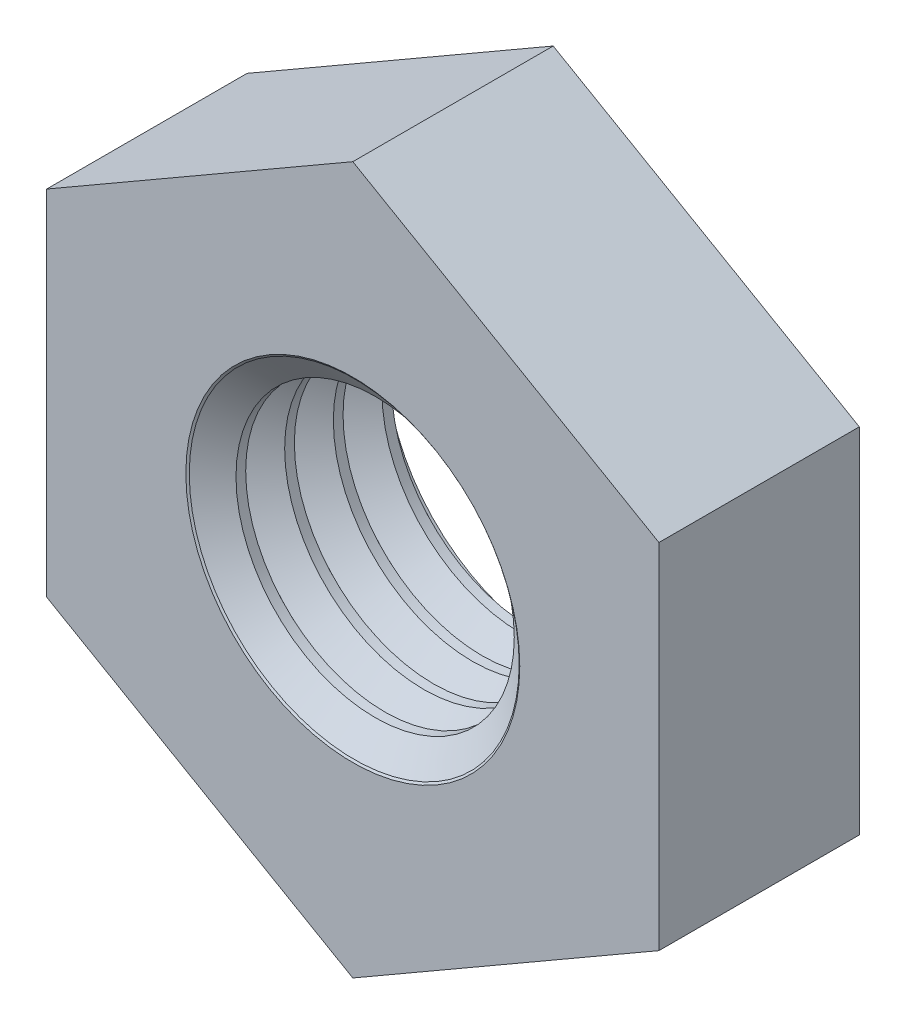
ISO-10303-21;
HEADER;
FILE_DESCRIPTION(('STEP AP214'),'2;1');
FILE_NAME('part.step','',(''),(''),'','','');
FILE_SCHEMA(('AUTOMOTIVE_DESIGN { 1 0 10303 214 1 1 1 1 }'));
ENDSEC;
DATA;
#1=APPLICATION_CONTEXT('core data for automotive mechanical design processes');
#2=APPLICATION_PROTOCOL_DEFINITION('international standard','automotive_design',2000,#1);
#3=PRODUCT_CONTEXT('',#1,'mechanical');
#4=PRODUCT('Part','Part','',(#3));
#5=PRODUCT_RELATED_PRODUCT_CATEGORY('part','',(#4));
#6=PRODUCT_DEFINITION_FORMATION('','',#4);
#7=PRODUCT_DEFINITION_CONTEXT('part definition',#1,'design');
#8=PRODUCT_DEFINITION('design','',#6,#7);
#9=PRODUCT_DEFINITION_SHAPE('','',#8);
#10=(LENGTH_UNIT() NAMED_UNIT(*) SI_UNIT(.MILLI.,.METRE.));
#11=(NAMED_UNIT(*) PLANE_ANGLE_UNIT() SI_UNIT($,.RADIAN.));
#12=(NAMED_UNIT(*) SI_UNIT($,.STERADIAN.) SOLID_ANGLE_UNIT());
#13=UNCERTAINTY_MEASURE_WITH_UNIT(LENGTH_MEASURE(1.E-05),#10,'distance_accuracy_value','');
#14=(GEOMETRIC_REPRESENTATION_CONTEXT(3) GLOBAL_UNCERTAINTY_ASSIGNED_CONTEXT((#13)) GLOBAL_UNIT_ASSIGNED_CONTEXT((#10,
#11,#12)) REPRESENTATION_CONTEXT('',''));
#15=CARTESIAN_POINT('',(0.,0.,0.));
#16=DIRECTION('',(0.,0.,1.));
#17=DIRECTION('',(1.,0.,0.));
#18=AXIS2_PLACEMENT_3D('',#15,#16,#17);
#19=CARTESIAN_POINT('',(0.,0.,-1.8));
#20=DIRECTION('',(0.,0.,1.));
#21=DIRECTION('',(1.,0.,0.));
#22=AXIS2_PLACEMENT_3D('',#19,#20,#21);
#23=CYLINDRICAL_SURFACE('',#22,1.25);
#24=CARTESIAN_POINT('',(0.,0.,-1.51235188455243));
#25=DIRECTION('',(0.,0.,-1.));
#26=DIRECTION('',(-1.,0.,0.));
#27=AXIS2_PLACEMENT_3D('',#24,#25,#26);
#28=CIRCLE('',#27,1.25);
#29=CARTESIAN_POINT('',(-1.25,0.,-1.51235188455243));
#30=VERTEX_POINT('',#29);
#31=EDGE_CURVE('E229',#30,#30,#28,.T.);
#32=ORIENTED_EDGE('',*,*,#31,.F.);
#33=EDGE_LOOP('',(#32));
#34=FACE_BOUND('',#33,.T.);
#35=CARTESIAN_POINT('',(0.,0.,-1.59954811544757));
#36=DIRECTION('',(0.,0.,-1.));
#37=DIRECTION('',(-1.,0.,0.));
#38=AXIS2_PLACEMENT_3D('',#35,#36,#37);
#39=CIRCLE('',#38,1.25);
#40=CARTESIAN_POINT('',(-1.25,0.,-1.59954811544757));
#41=VERTEX_POINT('',#40);
#42=EDGE_CURVE('E152',#41,#41,#39,.F.);
#43=ORIENTED_EDGE('',*,*,#42,.F.);
#44=EDGE_LOOP('',(#43));
#45=FACE_BOUND('',#44,.T.);
#46=ADVANCED_FACE('F41',(#34,#45),#23,.F.);
#47=CARTESIAN_POINT('',(0.,0.,-1.16224811544758));
#48=DIRECTION('',(0.,0.,-1.));
#49=DIRECTION('',(-1.,0.,0.));
#50=AXIS2_PLACEMENT_3D('',#47,#48,#49);
#51=CIRCLE('',#50,1.25);
#52=CARTESIAN_POINT('',(-1.25,0.,-1.16224811544758));
#53=VERTEX_POINT('',#52);
#54=EDGE_CURVE('E232',#53,#53,#51,.T.);
#55=ORIENTED_EDGE('',*,*,#54,.T.);
#56=EDGE_LOOP('',(#55));
#57=FACE_BOUND('',#56,.T.);
#58=CARTESIAN_POINT('',(0.,0.,-1.07505188455243));
#59=DIRECTION('',(0.,0.,-1.));
#60=DIRECTION('',(-1.,0.,0.));
#61=AXIS2_PLACEMENT_3D('',#58,#59,#60);
#62=CIRCLE('',#61,1.25);
#63=CARTESIAN_POINT('',(-1.25,0.,-1.07505188455243));
#64=VERTEX_POINT('',#63);
#65=EDGE_CURVE('E220',#64,#64,#62,.T.);
#66=ORIENTED_EDGE('',*,*,#65,.F.);
#67=EDGE_LOOP('',(#66));
#68=FACE_BOUND('',#67,.T.);
#69=ADVANCED_FACE('F179',(#57,#68),#23,.F.);
#70=CARTESIAN_POINT('',(0.,0.,-0.724948115447577));
#71=DIRECTION('',(0.,0.,-1.));
#72=DIRECTION('',(-1.,0.,0.));
#73=AXIS2_PLACEMENT_3D('',#70,#71,#72);
#74=CIRCLE('',#73,1.25);
#75=CARTESIAN_POINT('',(-1.25,0.,-0.724948115447577));
#76=VERTEX_POINT('',#75);
#77=EDGE_CURVE('E223',#76,#76,#74,.T.);
#78=ORIENTED_EDGE('',*,*,#77,.T.);
#79=EDGE_LOOP('',(#78));
#80=FACE_BOUND('',#79,.T.);
#81=CARTESIAN_POINT('',(0.,0.,-0.63775188455243));
#82=DIRECTION('',(0.,0.,-1.));
#83=DIRECTION('',(-1.,0.,0.));
#84=AXIS2_PLACEMENT_3D('',#81,#82,#83);
#85=CIRCLE('',#84,1.25);
#86=CARTESIAN_POINT('',(-1.25,0.,-0.63775188455243));
#87=VERTEX_POINT('',#86);
#88=EDGE_CURVE('E211',#87,#87,#85,.T.);
#89=ORIENTED_EDGE('',*,*,#88,.F.);
#90=EDGE_LOOP('',(#89));
#91=FACE_BOUND('',#90,.T.);
#92=ADVANCED_FACE('F185',(#80,#91),#23,.F.);
#93=CARTESIAN_POINT('',(0.,0.,-0.287648115447577));
#94=DIRECTION('',(0.,0.,-1.));
#95=DIRECTION('',(-1.,0.,0.));
#96=AXIS2_PLACEMENT_3D('',#93,#94,#95);
#97=CIRCLE('',#96,1.25);
#98=CARTESIAN_POINT('',(-1.25,0.,-0.287648115447577));
#99=VERTEX_POINT('',#98);
#100=EDGE_CURVE('E201',#99,#99,#97,.T.);
#101=ORIENTED_EDGE('',*,*,#100,.T.);
#102=EDGE_LOOP('',(#101));
#103=FACE_BOUND('',#102,.T.);
#104=CARTESIAN_POINT('',(0.,0.,-0.200451884552429));
#105=DIRECTION('',(0.,0.,-1.));
#106=DIRECTION('',(-1.,0.,0.));
#107=AXIS2_PLACEMENT_3D('',#104,#105,#106);
#108=CIRCLE('',#107,1.25);
#109=CARTESIAN_POINT('',(-1.25,0.,-0.200451884552429));
#110=VERTEX_POINT('',#109);
#111=EDGE_CURVE('E204',#110,#110,#108,.T.);
#112=ORIENTED_EDGE('',*,*,#111,.F.);
#113=EDGE_LOOP('',(#112));
#114=FACE_BOUND('',#113,.T.);
#115=ADVANCED_FACE('F176',(#103,#114),#23,.F.);
#116=CARTESIAN_POINT('',(0.,3.17542648054295,-1.8));
#117=DIRECTION('',(-0.500000000000008,0.866025403784434,0.));
#118=DIRECTION('',(-0.866025403784434,-0.500000000000008,0.));
#119=AXIS2_PLACEMENT_3D('',#116,#117,#118);
#120=PLANE('',#119);
#121=DIRECTION('',(-0.866025403784434,-0.500000000000008,0.));
#122=VECTOR('',#121,1.);
#123=CARTESIAN_POINT('',(0.,3.17542648054295,0.));
#124=LINE('',#123,#122);
#125=CARTESIAN_POINT('',(0.,3.17542648054295,0.));
#126=VERTEX_POINT('',#125);
#127=CARTESIAN_POINT('',(-2.75,1.58771324027145,0.));
#128=VERTEX_POINT('',#127);
#129=EDGE_CURVE('E128',#126,#128,#124,.T.);
#130=ORIENTED_EDGE('',*,*,#129,.F.);
#131=DIRECTION('',(0.,0.,1.));
#132=VECTOR('',#131,1.);
#133=CARTESIAN_POINT('',(0.,3.17542648054295,-1.8));
#134=LINE('',#133,#132);
#135=CARTESIAN_POINT('',(0.,3.17542648054295,-1.8));
#136=VERTEX_POINT('',#135);
#137=EDGE_CURVE('E11',#136,#126,#134,.T.);
#138=ORIENTED_EDGE('',*,*,#137,.F.);
#139=DIRECTION('',(-0.866025403784434,-0.500000000000008,0.));
#140=VECTOR('',#139,1.);
#141=CARTESIAN_POINT('',(0.,3.17542648054295,-1.8));
#142=LINE('',#141,#140);
#143=CARTESIAN_POINT('',(-2.75,1.58771324027145,-1.8));
#144=VERTEX_POINT('',#143);
#145=EDGE_CURVE('E143',#136,#144,#142,.T.);
#146=ORIENTED_EDGE('',*,*,#145,.T.);
#147=DIRECTION('',(0.,0.,1.));
#148=VECTOR('',#147,1.);
#149=CARTESIAN_POINT('',(-2.75,1.58771324027145,-1.8));
#150=LINE('',#149,#148);
#151=EDGE_CURVE('E92',#144,#128,#150,.T.);
#152=ORIENTED_EDGE('',*,*,#151,.T.);
#153=EDGE_LOOP('',(#130,#138,#146,#152));
#154=FACE_BOUND('',#153,.T.);
#155=ADVANCED_FACE('F43',(#154),#120,.T.);
#156=CARTESIAN_POINT('',(2.75,1.58771324027146,-1.8));
#157=DIRECTION('',(0.500000000000005,0.866025403784436,0.));
#158=DIRECTION('',(-0.866025403784436,0.500000000000005,0.));
#159=AXIS2_PLACEMENT_3D('',#156,#157,#158);
#160=PLANE('',#159);
#161=DIRECTION('',(-0.866025403784436,0.500000000000005,0.));
#162=VECTOR('',#161,1.);
#163=CARTESIAN_POINT('',(2.75,1.58771324027146,0.));
#164=LINE('',#163,#162);
#165=CARTESIAN_POINT('',(2.75,1.58771324027146,0.));
#166=VERTEX_POINT('',#165);
#167=EDGE_CURVE('E141',#166,#126,#164,.T.);
#168=ORIENTED_EDGE('',*,*,#167,.F.);
#169=DIRECTION('',(0.,0.,1.));
#170=VECTOR('',#169,1.);
#171=CARTESIAN_POINT('',(2.75,1.58771324027146,-1.8));
#172=LINE('',#171,#170);
#173=CARTESIAN_POINT('',(2.75,1.58771324027146,-1.8));
#174=VERTEX_POINT('',#173);
#175=EDGE_CURVE('E51',#174,#166,#172,.T.);
#176=ORIENTED_EDGE('',*,*,#175,.F.);
#177=DIRECTION('',(-0.866025403784436,0.500000000000005,0.));
#178=VECTOR('',#177,1.);
#179=CARTESIAN_POINT('',(2.75,1.58771324027146,-1.8));
#180=LINE('',#179,#178);
#181=EDGE_CURVE('E110',#174,#136,#180,.T.);
#182=ORIENTED_EDGE('',*,*,#181,.T.);
#183=ORIENTED_EDGE('',*,*,#137,.T.);
#184=EDGE_LOOP('',(#168,#176,#182,#183));
#185=FACE_BOUND('',#184,.T.);
#186=ADVANCED_FACE('F168',(#185),#160,.T.);
#187=CARTESIAN_POINT('',(2.75,1.58771324027146,-1.8));
#188=DIRECTION('',(-1.,0.,0.));
#189=DIRECTION('',(0.,0.,1.));
#190=AXIS2_PLACEMENT_3D('',#187,#188,#189);
#191=PLANE('',#190);
#192=DIRECTION('',(0.,-1.,0.));
#193=VECTOR('',#192,1.);
#194=CARTESIAN_POINT('',(2.75,1.58771324027146,0.));
#195=LINE('',#194,#193);
#196=CARTESIAN_POINT('',(2.75,-1.58771324027149,0.));
#197=VERTEX_POINT('',#196);
#198=EDGE_CURVE('E114',#166,#197,#195,.T.);
#199=ORIENTED_EDGE('',*,*,#198,.T.);
#200=DIRECTION('',(0.,0.,1.));
#201=VECTOR('',#200,1.);
#202=CARTESIAN_POINT('',(2.75,-1.58771324027149,-1.8));
#203=LINE('',#202,#201);
#204=CARTESIAN_POINT('',(2.75,-1.58771324027149,-1.8));
#205=VERTEX_POINT('',#204);
#206=EDGE_CURVE('E112',#205,#197,#203,.T.);
#207=ORIENTED_EDGE('',*,*,#206,.F.);
#208=DIRECTION('',(0.,-1.,0.));
#209=VECTOR('',#208,1.);
#210=CARTESIAN_POINT('',(2.75,1.58771324027146,-1.8));
#211=LINE('',#210,#209);
#212=EDGE_CURVE('E103',#174,#205,#211,.T.);
#213=ORIENTED_EDGE('',*,*,#212,.F.);
#214=ORIENTED_EDGE('',*,*,#175,.T.);
#215=EDGE_LOOP('',(#199,#207,#213,#214));
#216=FACE_BOUND('',#215,.T.);
#217=ADVANCED_FACE('F113',(#216),#191,.F.);
#218=CARTESIAN_POINT('',(0.,-3.175426480543,-1.8));
#219=DIRECTION('',(0.500000000000008,-0.866025403784434,0.));
#220=DIRECTION('',(0.866025403784434,0.500000000000008,0.));
#221=AXIS2_PLACEMENT_3D('',#218,#219,#220);
#222=PLANE('',#221);
#223=DIRECTION('',(0.866025403784434,0.500000000000008,0.));
#224=VECTOR('',#223,1.);
#225=CARTESIAN_POINT('',(0.,-3.175426480543,0.));
#226=LINE('',#225,#224);
#227=CARTESIAN_POINT('',(0.,-3.175426480543,0.));
#228=VERTEX_POINT('',#227);
#229=EDGE_CURVE('E138',#228,#197,#226,.T.);
#230=ORIENTED_EDGE('',*,*,#229,.F.);
#231=DIRECTION('',(0.,0.,1.));
#232=VECTOR('',#231,1.);
#233=CARTESIAN_POINT('',(0.,-3.175426480543,-1.8));
#234=LINE('',#233,#232);
#235=CARTESIAN_POINT('',(0.,-3.175426480543,-1.8));
#236=VERTEX_POINT('',#235);
#237=EDGE_CURVE('E118',#236,#228,#234,.T.);
#238=ORIENTED_EDGE('',*,*,#237,.F.);
#239=DIRECTION('',(0.866025403784434,0.500000000000008,0.));
#240=VECTOR('',#239,1.);
#241=CARTESIAN_POINT('',(0.,-3.175426480543,-1.8));
#242=LINE('',#241,#240);
#243=EDGE_CURVE('E108',#236,#205,#242,.T.);
#244=ORIENTED_EDGE('',*,*,#243,.T.);
#245=ORIENTED_EDGE('',*,*,#206,.T.);
#246=EDGE_LOOP('',(#230,#238,#244,#245));
#247=FACE_BOUND('',#246,.T.);
#248=ADVANCED_FACE('F120',(#247),#222,.T.);
#249=CARTESIAN_POINT('',(-2.75,-1.58771324027151,-1.8));
#250=DIRECTION('',(-0.500000000000004,-0.866025403784436,0.));
#251=DIRECTION('',(0.866025403784436,-0.500000000000004,0.));
#252=AXIS2_PLACEMENT_3D('',#249,#250,#251);
#253=PLANE('',#252);
#254=DIRECTION('',(0.866025403784436,-0.500000000000004,0.));
#255=VECTOR('',#254,1.);
#256=CARTESIAN_POINT('',(-2.75,-1.58771324027151,0.));
#257=LINE('',#256,#255);
#258=CARTESIAN_POINT('',(-2.75,-1.58771324027151,0.));
#259=VERTEX_POINT('',#258);
#260=EDGE_CURVE('E135',#259,#228,#257,.T.);
#261=ORIENTED_EDGE('',*,*,#260,.F.);
#262=DIRECTION('',(0.,0.,1.));
#263=VECTOR('',#262,1.);
#264=CARTESIAN_POINT('',(-2.75,-1.58771324027151,-1.8));
#265=LINE('',#264,#263);
#266=CARTESIAN_POINT('',(-2.75,-1.58771324027151,-1.8));
#267=VERTEX_POINT('',#266);
#268=EDGE_CURVE('E147',#267,#259,#265,.T.);
#269=ORIENTED_EDGE('',*,*,#268,.F.);
#270=DIRECTION('',(0.866025403784436,-0.500000000000004,0.));
#271=VECTOR('',#270,1.);
#272=CARTESIAN_POINT('',(-2.75,-1.58771324027151,-1.8));
#273=LINE('',#272,#271);
#274=EDGE_CURVE('E121',#267,#236,#273,.T.);
#275=ORIENTED_EDGE('',*,*,#274,.T.);
#276=ORIENTED_EDGE('',*,*,#237,.T.);
#277=EDGE_LOOP('',(#261,#269,#275,#276));
#278=FACE_BOUND('',#277,.T.);
#279=ADVANCED_FACE('F301',(#278),#253,.T.);
#280=CARTESIAN_POINT('',(-2.75,1.58771324027145,-1.8));
#281=DIRECTION('',(-1.,0.,0.));
#282=DIRECTION('',(0.,0.,1.));
#283=AXIS2_PLACEMENT_3D('',#280,#281,#282);
#284=PLANE('',#283);
#285=DIRECTION('',(0.,-1.,0.));
#286=VECTOR('',#285,1.);
#287=CARTESIAN_POINT('',(-2.75,1.58771324027145,0.));
#288=LINE('',#287,#286);
#289=EDGE_CURVE('E131',#128,#259,#288,.T.);
#290=ORIENTED_EDGE('',*,*,#289,.F.);
#291=ORIENTED_EDGE('',*,*,#151,.F.);
#292=DIRECTION('',(0.,-1.,0.));
#293=VECTOR('',#292,1.);
#294=CARTESIAN_POINT('',(-2.75,1.58771324027145,-1.8));
#295=LINE('',#294,#293);
#296=EDGE_CURVE('E123',#144,#267,#295,.T.);
#297=ORIENTED_EDGE('',*,*,#296,.T.);
#298=ORIENTED_EDGE('',*,*,#268,.T.);
#299=EDGE_LOOP('',(#290,#291,#297,#298));
#300=FACE_BOUND('',#299,.T.);
#301=ADVANCED_FACE('F164',(#300),#284,.T.);
#302=CARTESIAN_POINT('',(0.,3.17542648054296,-1.8));
#303=DIRECTION('',(0.,0.,-1.));
#304=DIRECTION('',(-1.,0.,0.));
#305=AXIS2_PLACEMENT_3D('',#302,#303,#304);
#306=PLANE('',#305);
#307=CARTESIAN_POINT('',(0.,0.,-1.8));
#308=DIRECTION('',(0.,0.,-1.));
#309=DIRECTION('',(-1.,0.,0.));
#310=AXIS2_PLACEMENT_3D('',#307,#308,#309);
#311=CIRCLE('',#310,1.5);
#312=CARTESIAN_POINT('',(-1.5,0.,-1.8));
#313=VERTEX_POINT('',#312);
#314=EDGE_CURVE('E150',#313,#313,#311,.F.);
#315=ORIENTED_EDGE('',*,*,#314,.T.);
#316=EDGE_LOOP('',(#315));
#317=FACE_BOUND('',#316,.T.);
#318=ORIENTED_EDGE('',*,*,#145,.F.);
#319=ORIENTED_EDGE('',*,*,#181,.F.);
#320=ORIENTED_EDGE('',*,*,#212,.T.);
#321=ORIENTED_EDGE('',*,*,#243,.F.);
#322=ORIENTED_EDGE('',*,*,#274,.F.);
#323=ORIENTED_EDGE('',*,*,#296,.F.);
#324=EDGE_LOOP('',(#318,#319,#320,#321,#322,#323));
#325=FACE_BOUND('',#324,.T.);
#326=ADVANCED_FACE('F105',(#317,#325),#306,.T.);
#327=CARTESIAN_POINT('',(0.,3.17542648054296,0.));
#328=DIRECTION('',(0.,0.,-1.));
#329=DIRECTION('',(-1.,0.,0.));
#330=AXIS2_PLACEMENT_3D('',#327,#328,#329);
#331=PLANE('',#330);
#332=CARTESIAN_POINT('',(0.,0.,0.));
#333=DIRECTION('',(0.,0.,1.));
#334=DIRECTION('',(1.,0.,0.));
#335=AXIS2_PLACEMENT_3D('',#332,#333,#334);
#336=CIRCLE('',#335,1.5);
#337=CARTESIAN_POINT('',(1.5,0.,0.));
#338=VERTEX_POINT('',#337);
#339=EDGE_CURVE('E132',#338,#338,#336,.T.);
#340=ORIENTED_EDGE('',*,*,#339,.F.);
#341=EDGE_LOOP('',(#340));
#342=FACE_BOUND('',#341,.T.);
#343=ORIENTED_EDGE('',*,*,#129,.T.);
#344=ORIENTED_EDGE('',*,*,#289,.T.);
#345=ORIENTED_EDGE('',*,*,#260,.T.);
#346=ORIENTED_EDGE('',*,*,#229,.T.);
#347=ORIENTED_EDGE('',*,*,#198,.F.);
#348=ORIENTED_EDGE('',*,*,#167,.T.);
#349=EDGE_LOOP('',(#343,#344,#345,#346,#347,#348));
#350=FACE_BOUND('',#349,.T.);
#351=ADVANCED_FACE('F167',(#342,#350),#331,.F.);
#352=CARTESIAN_POINT('',(0.,0.,-0.192557073007665));
#353=DIRECTION('',(0.,0.,1.));
#354=DIRECTION('',(1.,0.,0.));
#355=AXIS2_PLACEMENT_3D('',#352,#353,#354);
#356=CONICAL_SURFACE('',#355,1.225,0.959931088596886);
#357=CARTESIAN_POINT('',(0.,0.,-0.0126999999999985));
#358=DIRECTION('',(0.,0.,-1.));
#359=DIRECTION('',(-1.,0.,0.));
#360=AXIS2_PLACEMENT_3D('',#357,#358,#359);
#361=CIRCLE('',#360,1.48186252031437);
#362=CARTESIAN_POINT('',(-1.48186252031437,0.,-0.0126999999999985));
#363=VERTEX_POINT('',#362);
#364=EDGE_CURVE('E45',#363,#363,#361,.F.);
#365=ORIENTED_EDGE('',*,*,#364,.F.);
#366=EDGE_LOOP('',(#365));
#367=FACE_BOUND('',#366,.T.);
#368=ORIENTED_EDGE('',*,*,#339,.T.);
#369=EDGE_LOOP('',(#368));
#370=FACE_BOUND('',#369,.T.);
#371=ADVANCED_FACE('F277',(#367,#370),#356,.F.);
#372=CARTESIAN_POINT('',(0.,0.,-1.7746));
#373=DIRECTION('',(0.,0.,-1.));
#374=DIRECTION('',(-1.,0.,0.));
#375=AXIS2_PLACEMENT_3D('',#372,#373,#374);
#376=CONICAL_SURFACE('',#375,1.5,0.959931088596886);
#377=CARTESIAN_POINT('',(0.,0.,-1.7746));
#378=DIRECTION('',(0.,0.,1.));
#379=DIRECTION('',(1.,0.,0.));
#380=AXIS2_PLACEMENT_3D('',#377,#378,#379);
#381=CIRCLE('',#380,1.5);
#382=CARTESIAN_POINT('',(1.5,0.,-1.7746));
#383=VERTEX_POINT('',#382);
#384=EDGE_CURVE('E153',#383,#383,#381,.T.);
#385=ORIENTED_EDGE('',*,*,#384,.F.);
#386=EDGE_LOOP('',(#385));
#387=FACE_BOUND('',#386,.T.);
#388=ORIENTED_EDGE('',*,*,#42,.T.);
#389=EDGE_LOOP('',(#388));
#390=FACE_BOUND('',#389,.T.);
#391=ADVANCED_FACE('F274',(#387,#390),#376,.F.);
#392=CARTESIAN_POINT('',(0.,0.,-25.0375057290932));
#393=DIRECTION('',(0.,0.,1.));
#394=DIRECTION('',(1.,0.,0.));
#395=AXIS2_PLACEMENT_3D('',#392,#393,#394);
#396=CYLINDRICAL_SURFACE('',#395,1.5);
#397=ORIENTED_EDGE('',*,*,#314,.F.);
#398=EDGE_LOOP('',(#397));
#399=FACE_BOUND('',#398,.T.);
#400=ORIENTED_EDGE('',*,*,#384,.T.);
#401=EDGE_LOOP('',(#400));
#402=FACE_BOUND('',#401,.T.);
#403=ADVANCED_FACE('F272',(#399,#402),#396,.F.);
#404=CARTESIAN_POINT('',(0.,0.,-0.0254));
#405=DIRECTION('',(0.,0.,-1.));
#406=DIRECTION('',(-1.,0.,0.));
#407=AXIS2_PLACEMENT_3D('',#404,#405,#406);
#408=CONICAL_SURFACE('',#407,1.5,0.959931088596893);
#409=ORIENTED_EDGE('',*,*,#364,.T.);
#410=EDGE_LOOP('',(#409));
#411=FACE_BOUND('',#410,.T.);
#412=CARTESIAN_POINT('',(0.,0.,-0.0254));
#413=DIRECTION('',(0.,0.,-1.));
#414=DIRECTION('',(-1.,0.,0.));
#415=AXIS2_PLACEMENT_3D('',#412,#413,#414);
#416=CIRCLE('',#415,1.5);
#417=CARTESIAN_POINT('',(-1.5,0.,-0.0254));
#418=VERTEX_POINT('',#417);
#419=EDGE_CURVE('E206',#418,#418,#416,.T.);
#420=ORIENTED_EDGE('',*,*,#419,.T.);
#421=EDGE_LOOP('',(#420));
#422=FACE_BOUND('',#421,.T.);
#423=ADVANCED_FACE('F268',(#411,#422),#408,.F.);
#424=CARTESIAN_POINT('',(0.,0.,-0.200451884552429));
#425=DIRECTION('',(0.,0.,1.));
#426=DIRECTION('',(1.,0.,0.));
#427=AXIS2_PLACEMENT_3D('',#424,#425,#426);
#428=CONICAL_SURFACE('',#427,1.25,0.959931088596876);
#429=ORIENTED_EDGE('',*,*,#419,.F.);
#430=EDGE_LOOP('',(#429));
#431=FACE_BOUND('',#430,.T.);
#432=ORIENTED_EDGE('',*,*,#111,.T.);
#433=EDGE_LOOP('',(#432));
#434=FACE_BOUND('',#433,.T.);
#435=ADVANCED_FACE('F264',(#431,#434),#428,.F.);
#436=CARTESIAN_POINT('',(0.,0.,-0.4627));
#437=DIRECTION('',(0.,0.,-1.));
#438=DIRECTION('',(-1.,0.,0.));
#439=AXIS2_PLACEMENT_3D('',#436,#437,#438);
#440=CONICAL_SURFACE('',#439,1.5,0.959931088596893);
#441=ORIENTED_EDGE('',*,*,#100,.F.);
#442=EDGE_LOOP('',(#441));
#443=FACE_BOUND('',#442,.T.);
#444=CARTESIAN_POINT('',(0.,0.,-0.4627));
#445=DIRECTION('',(0.,0.,-1.));
#446=DIRECTION('',(-1.,0.,0.));
#447=AXIS2_PLACEMENT_3D('',#444,#445,#446);
#448=CIRCLE('',#447,1.5);
#449=CARTESIAN_POINT('',(-1.5,0.,-0.4627));
#450=VERTEX_POINT('',#449);
#451=EDGE_CURVE('E207',#450,#450,#448,.T.);
#452=ORIENTED_EDGE('',*,*,#451,.T.);
#453=EDGE_LOOP('',(#452));
#454=FACE_BOUND('',#453,.T.);
#455=ADVANCED_FACE('F261',(#443,#454),#440,.F.);
#456=CARTESIAN_POINT('',(0.,0.,-0.63775188455243));
#457=DIRECTION('',(0.,0.,1.));
#458=DIRECTION('',(1.,0.,0.));
#459=AXIS2_PLACEMENT_3D('',#456,#457,#458);
#460=CONICAL_SURFACE('',#459,1.25,0.959931088596876);
#461=ORIENTED_EDGE('',*,*,#451,.F.);
#462=EDGE_LOOP('',(#461));
#463=FACE_BOUND('',#462,.T.);
#464=ORIENTED_EDGE('',*,*,#88,.T.);
#465=EDGE_LOOP('',(#464));
#466=FACE_BOUND('',#465,.T.);
#467=ADVANCED_FACE('F257',(#463,#466),#460,.F.);
#468=CARTESIAN_POINT('',(0.,0.,-0.9));
#469=DIRECTION('',(0.,0.,-1.));
#470=DIRECTION('',(-1.,0.,0.));
#471=AXIS2_PLACEMENT_3D('',#468,#469,#470);
#472=CONICAL_SURFACE('',#471,1.5,0.959931088596893);
#473=ORIENTED_EDGE('',*,*,#77,.F.);
#474=EDGE_LOOP('',(#473));
#475=FACE_BOUND('',#474,.T.);
#476=CARTESIAN_POINT('',(0.,0.,-0.9));
#477=DIRECTION('',(0.,0.,-1.));
#478=DIRECTION('',(-1.,0.,0.));
#479=AXIS2_PLACEMENT_3D('',#476,#477,#478);
#480=CIRCLE('',#479,1.5);
#481=CARTESIAN_POINT('',(-1.5,0.,-0.9));
#482=VERTEX_POINT('',#481);
#483=EDGE_CURVE('E217',#482,#482,#480,.T.);
#484=ORIENTED_EDGE('',*,*,#483,.T.);
#485=EDGE_LOOP('',(#484));
#486=FACE_BOUND('',#485,.T.);
#487=ADVANCED_FACE('F253',(#475,#486),#472,.F.);
#488=CARTESIAN_POINT('',(0.,0.,-1.07505188455243));
#489=DIRECTION('',(0.,0.,1.));
#490=DIRECTION('',(1.,0.,0.));
#491=AXIS2_PLACEMENT_3D('',#488,#489,#490);
#492=CONICAL_SURFACE('',#491,1.25,0.959931088596876);
#493=ORIENTED_EDGE('',*,*,#483,.F.);
#494=EDGE_LOOP('',(#493));
#495=FACE_BOUND('',#494,.T.);
#496=ORIENTED_EDGE('',*,*,#65,.T.);
#497=EDGE_LOOP('',(#496));
#498=FACE_BOUND('',#497,.T.);
#499=ADVANCED_FACE('F241',(#495,#498),#492,.F.);
#500=CARTESIAN_POINT('',(0.,0.,-1.3373));
#501=DIRECTION('',(0.,0.,-1.));
#502=DIRECTION('',(-1.,0.,0.));
#503=AXIS2_PLACEMENT_3D('',#500,#501,#502);
#504=CONICAL_SURFACE('',#503,1.5,0.959931088596893);
#505=ORIENTED_EDGE('',*,*,#54,.F.);
#506=EDGE_LOOP('',(#505));
#507=FACE_BOUND('',#506,.T.);
#508=CARTESIAN_POINT('',(0.,0.,-1.3373));
#509=DIRECTION('',(0.,0.,-1.));
#510=DIRECTION('',(-1.,0.,0.));
#511=AXIS2_PLACEMENT_3D('',#508,#509,#510);
#512=CIRCLE('',#511,1.5);
#513=CARTESIAN_POINT('',(-1.5,0.,-1.3373));
#514=VERTEX_POINT('',#513);
#515=EDGE_CURVE('E226',#514,#514,#512,.T.);
#516=ORIENTED_EDGE('',*,*,#515,.T.);
#517=EDGE_LOOP('',(#516));
#518=FACE_BOUND('',#517,.T.);
#519=ADVANCED_FACE('F237',(#507,#518),#504,.F.);
#520=CARTESIAN_POINT('',(0.,0.,-1.51235188455243));
#521=DIRECTION('',(0.,0.,1.));
#522=DIRECTION('',(1.,0.,0.));
#523=AXIS2_PLACEMENT_3D('',#520,#521,#522);
#524=CONICAL_SURFACE('',#523,1.25,0.959931088596876);
#525=ORIENTED_EDGE('',*,*,#515,.F.);
#526=EDGE_LOOP('',(#525));
#527=FACE_BOUND('',#526,.T.);
#528=ORIENTED_EDGE('',*,*,#31,.T.);
#529=EDGE_LOOP('',(#528));
#530=FACE_BOUND('',#529,.T.);
#531=ADVANCED_FACE('F240',(#527,#530),#524,.F.);
#532=CLOSED_SHELL('',(#46,#69,#92,#115,#155,#186,#217,#248,#279,#301,#326,#351,#371,#391,#403,
#423,#435,#455,#467,#487,#499,#519,#531));
#533=MANIFOLD_SOLID_BREP('B2',#532);
#534=ADVANCED_BREP_SHAPE_REPRESENTATION('',(#18,#533),#14);
#535=SHAPE_DEFINITION_REPRESENTATION(#9,#534);
ENDSEC;
END-ISO-10303-21;
